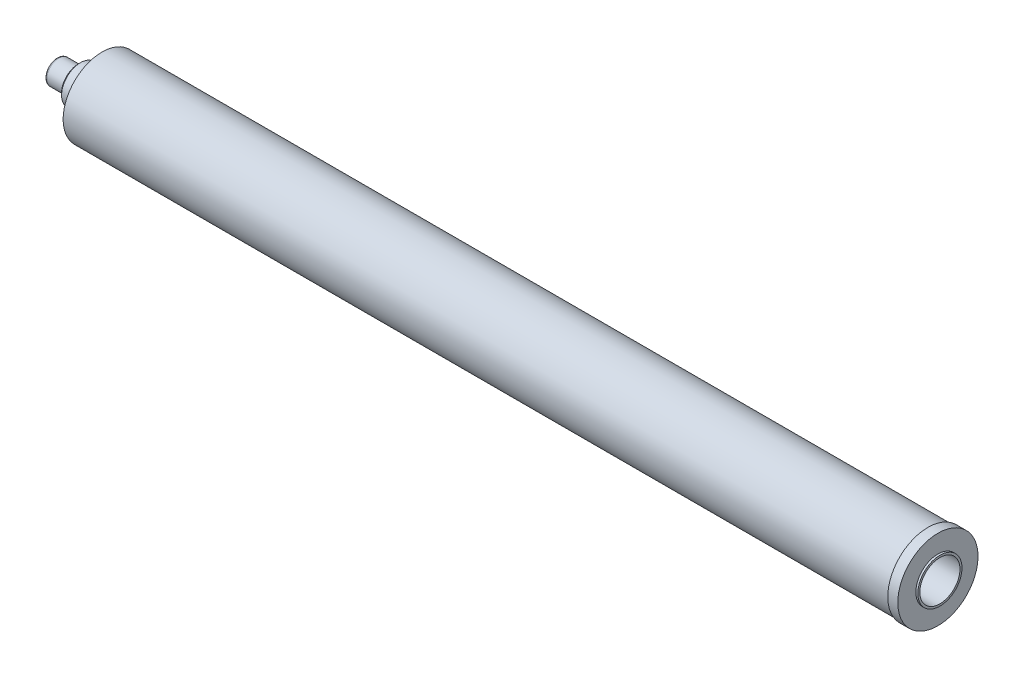
ISO-10303-21;
HEADER;
FILE_DESCRIPTION(('STEP AP214'),'2;1');
FILE_NAME('part.step','',(''),(''),'','','');
FILE_SCHEMA(('AUTOMOTIVE_DESIGN { 1 0 10303 214 1 1 1 1 }'));
ENDSEC;
DATA;
#1=APPLICATION_CONTEXT('core data for automotive mechanical design processes');
#2=APPLICATION_PROTOCOL_DEFINITION('international standard','automotive_design',2000,#1);
#3=PRODUCT_CONTEXT('',#1,'mechanical');
#4=PRODUCT('Part','Part','',(#3));
#5=PRODUCT_RELATED_PRODUCT_CATEGORY('part','',(#4));
#6=PRODUCT_DEFINITION_FORMATION('','',#4);
#7=PRODUCT_DEFINITION_CONTEXT('part definition',#1,'design');
#8=PRODUCT_DEFINITION('design','',#6,#7);
#9=PRODUCT_DEFINITION_SHAPE('','',#8);
#10=(LENGTH_UNIT() NAMED_UNIT(*) SI_UNIT(.MILLI.,.METRE.));
#11=(NAMED_UNIT(*) PLANE_ANGLE_UNIT() SI_UNIT($,.RADIAN.));
#12=(NAMED_UNIT(*) SI_UNIT($,.STERADIAN.) SOLID_ANGLE_UNIT());
#13=UNCERTAINTY_MEASURE_WITH_UNIT(LENGTH_MEASURE(1.E-05),#10,'distance_accuracy_value','');
#14=(GEOMETRIC_REPRESENTATION_CONTEXT(3) GLOBAL_UNCERTAINTY_ASSIGNED_CONTEXT((#13)) GLOBAL_UNIT_ASSIGNED_CONTEXT((#10,
#11,#12)) REPRESENTATION_CONTEXT('',''));
#15=CARTESIAN_POINT('',(0.,0.,0.));
#16=DIRECTION('',(0.,0.,1.));
#17=DIRECTION('',(1.,0.,0.));
#18=AXIS2_PLACEMENT_3D('',#15,#16,#17);
#19=CARTESIAN_POINT('',(0.,0.,0.));
#20=DIRECTION('',(-1.,0.,0.));
#21=DIRECTION('',(0.,-1.,0.));
#22=AXIS2_PLACEMENT_3D('',#19,#20,#21);
#23=PLANE('',#22);
#24=CARTESIAN_POINT('',(0.,0.,0.));
#25=DIRECTION('',(-1.,0.,0.));
#26=DIRECTION('',(0.,-1.,0.));
#27=AXIS2_PLACEMENT_3D('',#24,#25,#26);
#28=CIRCLE('',#27,12.6999999999999);
#29=CARTESIAN_POINT('',(0.,-12.6999999999999,0.));
#30=VERTEX_POINT('',#29);
#31=EDGE_CURVE('E100',#30,#30,#28,.T.);
#32=ORIENTED_EDGE('',*,*,#31,.T.);
#33=EDGE_LOOP('',(#32));
#34=FACE_BOUND('',#33,.T.);
#35=CARTESIAN_POINT('',(0.,0.,0.));
#36=DIRECTION('',(-1.,0.,0.));
#37=DIRECTION('',(0.,0.,1.));
#38=AXIS2_PLACEMENT_3D('',#35,#36,#37);
#39=CIRCLE('',#38,9.6774);
#40=CARTESIAN_POINT('',(0.,0.,9.6774));
#41=VERTEX_POINT('',#40);
#42=EDGE_CURVE('E73',#41,#41,#39,.T.);
#43=ORIENTED_EDGE('',*,*,#42,.F.);
#44=EDGE_LOOP('',(#43));
#45=FACE_BOUND('',#44,.T.);
#46=ADVANCED_FACE('F41',(#34,#45),#23,.T.);
#47=CARTESIAN_POINT('',(1115.822,1.32231727996655E-13,0.));
#48=DIRECTION('',(1.,0.,0.));
#49=DIRECTION('',(0.,1.,0.));
#50=AXIS2_PLACEMENT_3D('',#47,#48,#49);
#51=CYLINDRICAL_SURFACE('',#50,15.2399999999999);
#52=CARTESIAN_POINT('',(2.53999999999999,0.,0.));
#53=DIRECTION('',(-1.,0.,0.));
#54=DIRECTION('',(0.,-1.,0.));
#55=AXIS2_PLACEMENT_3D('',#52,#53,#54);
#56=CIRCLE('',#55,15.2399999999999);
#57=CARTESIAN_POINT('',(2.53999999999999,-15.2399999999999,0.));
#58=VERTEX_POINT('',#57);
#59=EDGE_CURVE('E96',#58,#58,#56,.F.);
#60=ORIENTED_EDGE('',*,*,#59,.T.);
#61=EDGE_LOOP('',(#60));
#62=FACE_BOUND('',#61,.T.);
#63=CARTESIAN_POINT('',(27.3049999999999,0.,0.));
#64=DIRECTION('',(1.,0.,0.));
#65=DIRECTION('',(0.,1.,0.));
#66=AXIS2_PLACEMENT_3D('',#63,#64,#65);
#67=CIRCLE('',#66,15.2399999999999);
#68=CARTESIAN_POINT('',(27.3049999999999,15.2399999999999,0.));
#69=VERTEX_POINT('',#68);
#70=EDGE_CURVE('E92',#69,#69,#67,.T.);
#71=ORIENTED_EDGE('',*,*,#70,.F.);
#72=EDGE_LOOP('',(#71));
#73=FACE_BOUND('',#72,.T.);
#74=ADVANCED_FACE('F125',(#62,#73),#51,.T.);
#75=CARTESIAN_POINT('',(27.305,15.2399999999999,0.));
#76=DIRECTION('',(-1.,0.,0.));
#77=DIRECTION('',(0.,-1.,0.));
#78=AXIS2_PLACEMENT_3D('',#75,#76,#77);
#79=PLANE('',#78);
#80=CARTESIAN_POINT('',(27.305,0.,0.));
#81=DIRECTION('',(-1.,0.,0.));
#82=DIRECTION('',(0.,-1.,0.));
#83=AXIS2_PLACEMENT_3D('',#80,#81,#82);
#84=CIRCLE('',#83,21.3359999999999);
#85=CARTESIAN_POINT('',(27.305,-21.3359999999999,0.));
#86=VERTEX_POINT('',#85);
#87=EDGE_CURVE('E11',#86,#86,#84,.T.);
#88=ORIENTED_EDGE('',*,*,#87,.T.);
#89=EDGE_LOOP('',(#88));
#90=FACE_BOUND('',#89,.T.);
#91=ORIENTED_EDGE('',*,*,#70,.T.);
#92=EDGE_LOOP('',(#91));
#93=FACE_BOUND('',#92,.T.);
#94=ADVANCED_FACE('F131',(#90,#93),#79,.T.);
#95=CARTESIAN_POINT('',(1115.822,1.32231727996655E-13,0.));
#96=DIRECTION('',(1.,0.,0.));
#97=DIRECTION('',(0.,1.,0.));
#98=AXIS2_PLACEMENT_3D('',#95,#96,#97);
#99=CYLINDRICAL_SURFACE('',#98,23.8759999999999);
#100=CARTESIAN_POINT('',(29.8450000000003,0.,0.));
#101=DIRECTION('',(-1.,0.,0.));
#102=DIRECTION('',(0.,-1.,0.));
#103=AXIS2_PLACEMENT_3D('',#100,#101,#102);
#104=CIRCLE('',#103,23.8759999999999);
#105=CARTESIAN_POINT('',(29.8450000000003,-23.8759999999999,0.));
#106=VERTEX_POINT('',#105);
#107=EDGE_CURVE('E50',#106,#106,#104,.F.);
#108=ORIENTED_EDGE('',*,*,#107,.T.);
#109=EDGE_LOOP('',(#108));
#110=FACE_BOUND('',#109,.T.);
#111=CARTESIAN_POINT('',(57.15,0.,0.));
#112=DIRECTION('',(1.,0.,0.));
#113=DIRECTION('',(0.,1.,0.));
#114=AXIS2_PLACEMENT_3D('',#111,#112,#113);
#115=CIRCLE('',#114,23.8759999999999);
#116=CARTESIAN_POINT('',(57.15,23.8759999999999,0.));
#117=VERTEX_POINT('',#116);
#118=EDGE_CURVE('E88',#117,#117,#115,.T.);
#119=ORIENTED_EDGE('',*,*,#118,.F.);
#120=EDGE_LOOP('',(#119));
#121=FACE_BOUND('',#120,.T.);
#122=ADVANCED_FACE('F107',(#110,#121),#99,.T.);
#123=CARTESIAN_POINT('',(57.15,23.8759999999999,0.));
#124=DIRECTION('',(-1.,0.,0.));
#125=DIRECTION('',(0.,-1.,0.));
#126=AXIS2_PLACEMENT_3D('',#123,#124,#125);
#127=PLANE('',#126);
#128=ORIENTED_EDGE('',*,*,#118,.T.);
#129=EDGE_LOOP('',(#128));
#130=FACE_BOUND('',#129,.T.);
#131=CARTESIAN_POINT('',(57.15,0.,0.));
#132=DIRECTION('',(1.,0.,0.));
#133=DIRECTION('',(0.,1.,0.));
#134=AXIS2_PLACEMENT_3D('',#131,#132,#133);
#135=CIRCLE('',#134,49.2124999999999);
#136=CARTESIAN_POINT('',(57.15,49.2124999999999,0.));
#137=VERTEX_POINT('',#136);
#138=EDGE_CURVE('E84',#137,#137,#135,.T.);
#139=ORIENTED_EDGE('',*,*,#138,.F.);
#140=EDGE_LOOP('',(#139));
#141=FACE_BOUND('',#140,.T.);
#142=ADVANCED_FACE('F141',(#130,#141),#127,.T.);
#143=CARTESIAN_POINT('',(1115.822,1.32231727996655E-13,0.));
#144=DIRECTION('',(1.,0.,0.));
#145=DIRECTION('',(0.,1.,0.));
#146=AXIS2_PLACEMENT_3D('',#143,#144,#145);
#147=CYLINDRICAL_SURFACE('',#146,49.2125);
#148=ORIENTED_EDGE('',*,*,#138,.T.);
#149=EDGE_LOOP('',(#148));
#150=FACE_BOUND('',#149,.T.);
#151=CARTESIAN_POINT('',(1103.122,1.3072670036182E-13,0.));
#152=DIRECTION('',(1.,0.,0.));
#153=DIRECTION('',(0.,1.,0.));
#154=AXIS2_PLACEMENT_3D('',#151,#152,#153);
#155=CIRCLE('',#154,49.2125);
#156=CARTESIAN_POINT('',(1103.122,49.2125000000001,0.));
#157=VERTEX_POINT('',#156);
#158=EDGE_CURVE('E80',#157,#157,#155,.T.);
#159=ORIENTED_EDGE('',*,*,#158,.F.);
#160=EDGE_LOOP('',(#159));
#161=FACE_BOUND('',#160,.T.);
#162=ADVANCED_FACE('F144',(#150,#161),#147,.T.);
#163=CARTESIAN_POINT('',(1103.122,49.2125000000001,0.));
#164=DIRECTION('',(-1.,0.,0.));
#165=DIRECTION('',(0.,-1.,0.));
#166=AXIS2_PLACEMENT_3D('',#163,#164,#165);
#167=PLANE('',#166);
#168=ORIENTED_EDGE('',*,*,#158,.T.);
#169=EDGE_LOOP('',(#168));
#170=FACE_BOUND('',#169,.T.);
#171=CARTESIAN_POINT('',(1103.122,1.3072670036182E-13,0.));
#172=DIRECTION('',(1.,0.,0.));
#173=DIRECTION('',(0.,1.,0.));
#174=AXIS2_PLACEMENT_3D('',#171,#172,#173);
#175=CIRCLE('',#174,50.8);
#176=CARTESIAN_POINT('',(1103.122,50.8000000000001,0.));
#177=VERTEX_POINT('',#176);
#178=EDGE_CURVE('E70',#177,#177,#175,.T.);
#179=ORIENTED_EDGE('',*,*,#178,.F.);
#180=EDGE_LOOP('',(#179));
#181=FACE_BOUND('',#180,.T.);
#182=ADVANCED_FACE('F148',(#170,#181),#167,.T.);
#183=CARTESIAN_POINT('',(1115.822,1.32231727996655E-13,0.));
#184=DIRECTION('',(1.,0.,0.));
#185=DIRECTION('',(0.,1.,0.));
#186=AXIS2_PLACEMENT_3D('',#183,#184,#185);
#187=CYLINDRICAL_SURFACE('',#186,50.8);
#188=ORIENTED_EDGE('',*,*,#178,.T.);
#189=EDGE_LOOP('',(#188));
#190=FACE_BOUND('',#189,.T.);
#191=CARTESIAN_POINT('',(1115.822,1.32231727996655E-13,0.));
#192=DIRECTION('',(1.,0.,0.));
#193=DIRECTION('',(0.,1.,0.));
#194=AXIS2_PLACEMENT_3D('',#191,#192,#193);
#195=CIRCLE('',#194,50.8);
#196=CARTESIAN_POINT('',(1115.822,50.8000000000001,0.));
#197=VERTEX_POINT('',#196);
#198=EDGE_CURVE('E64',#197,#197,#195,.T.);
#199=ORIENTED_EDGE('',*,*,#198,.F.);
#200=EDGE_LOOP('',(#199));
#201=FACE_BOUND('',#200,.T.);
#202=ADVANCED_FACE('F152',(#190,#201),#187,.T.);
#203=CARTESIAN_POINT('',(1115.822,50.8000000000001,0.));
#204=DIRECTION('',(1.,0.,0.));
#205=DIRECTION('',(0.,1.,0.));
#206=AXIS2_PLACEMENT_3D('',#203,#204,#205);
#207=PLANE('',#206);
#208=CARTESIAN_POINT('',(1115.822,1.32231727996655E-13,0.));
#209=DIRECTION('',(1.,0.,0.));
#210=DIRECTION('',(0.,1.,0.));
#211=AXIS2_PLACEMENT_3D('',#208,#209,#210);
#212=CIRCLE('',#211,27.94);
#213=CARTESIAN_POINT('',(1115.822,27.9400000000001,0.));
#214=VERTEX_POINT('',#213);
#215=EDGE_CURVE('E186',#214,#214,#212,.T.);
#216=ORIENTED_EDGE('',*,*,#215,.F.);
#217=EDGE_LOOP('',(#216));
#218=FACE_BOUND('',#217,.T.);
#219=ORIENTED_EDGE('',*,*,#198,.T.);
#220=EDGE_LOOP('',(#219));
#221=FACE_BOUND('',#220,.T.);
#222=ADVANCED_FACE('F57',(#218,#221),#207,.T.);
#223=CARTESIAN_POINT('',(25.4,0.,0.));
#224=DIRECTION('',(-1.,0.,0.));
#225=DIRECTION('',(0.,0.,1.));
#226=AXIS2_PLACEMENT_3D('',#223,#224,#225);
#227=CONICAL_SURFACE('',#226,5.04189999999999,1.02974425867665);
#228=CARTESIAN_POINT('',(28.4294791550751,0.,0.));
#229=VERTEX_POINT('',#228);
#230=VERTEX_LOOP('',#229);
#231=FACE_BOUND('',#230,.T.);
#232=CARTESIAN_POINT('',(25.4,0.,0.));
#233=DIRECTION('',(-1.,0.,0.));
#234=DIRECTION('',(0.,0.,1.));
#235=AXIS2_PLACEMENT_3D('',#232,#233,#234);
#236=CIRCLE('',#235,5.04189999999999);
#237=CARTESIAN_POINT('',(25.4,0.,5.04189999999999));
#238=VERTEX_POINT('',#237);
#239=EDGE_CURVE('E61',#238,#238,#236,.T.);
#240=ORIENTED_EDGE('',*,*,#239,.T.);
#241=EDGE_LOOP('',(#240));
#242=FACE_BOUND('',#241,.T.);
#243=ADVANCED_FACE('F53',(#231,#242),#227,.F.);
#244=CARTESIAN_POINT('',(0.,0.,0.));
#245=DIRECTION('',(-1.,0.,0.));
#246=DIRECTION('',(0.,0.,1.));
#247=AXIS2_PLACEMENT_3D('',#244,#245,#246);
#248=CYLINDRICAL_SURFACE('',#247,5.04189999999999);
#249=ORIENTED_EDGE('',*,*,#239,.F.);
#250=EDGE_LOOP('',(#249));
#251=FACE_BOUND('',#250,.T.);
#252=CARTESIAN_POINT('',(3.88964634032228,0.,0.));
#253=DIRECTION('',(-1.,0.,0.));
#254=DIRECTION('',(0.,0.,1.));
#255=AXIS2_PLACEMENT_3D('',#252,#253,#254);
#256=CIRCLE('',#255,5.04189999999999);
#257=CARTESIAN_POINT('',(3.88964634032228,0.,5.04189999999999));
#258=VERTEX_POINT('',#257);
#259=EDGE_CURVE('E65',#258,#258,#256,.T.);
#260=ORIENTED_EDGE('',*,*,#259,.T.);
#261=EDGE_LOOP('',(#260));
#262=FACE_BOUND('',#261,.T.);
#263=ADVANCED_FACE('F56',(#251,#262),#248,.F.);
#264=CARTESIAN_POINT('',(0.,0.,0.));
#265=DIRECTION('',(-1.,0.,0.));
#266=DIRECTION('',(0.,0.,1.));
#267=AXIS2_PLACEMENT_3D('',#264,#265,#266);
#268=CONICAL_SURFACE('',#267,9.6774,0.872664625997166);
#269=ORIENTED_EDGE('',*,*,#259,.F.);
#270=EDGE_LOOP('',(#269));
#271=FACE_BOUND('',#270,.T.);
#272=ORIENTED_EDGE('',*,*,#42,.T.);
#273=EDGE_LOOP('',(#272));
#274=FACE_BOUND('',#273,.T.);
#275=ADVANCED_FACE('F121',(#271,#274),#268,.F.);
#276=CARTESIAN_POINT('',(2.53999999999999,0.,0.));
#277=DIRECTION('',(-1.,0.,0.));
#278=DIRECTION('',(0.,-1.,0.));
#279=AXIS2_PLACEMENT_3D('',#276,#277,#278);
#280=TOROIDAL_SURFACE('',#279,12.6999999999999,2.54);
#281=ORIENTED_EDGE('',*,*,#31,.F.);
#282=EDGE_LOOP('',(#281));
#283=FACE_BOUND('',#282,.T.);
#284=ORIENTED_EDGE('',*,*,#59,.F.);
#285=EDGE_LOOP('',(#284));
#286=FACE_BOUND('',#285,.T.);
#287=ADVANCED_FACE('F112',(#283,#286),#280,.T.);
#288=CARTESIAN_POINT('',(29.8450000000003,0.,0.));
#289=DIRECTION('',(1.,0.,0.));
#290=DIRECTION('',(0.,1.,0.));
#291=AXIS2_PLACEMENT_3D('',#288,#289,#290);
#292=CONICAL_SURFACE('',#291,23.8759999999999,0.785398163397392);
#293=ORIENTED_EDGE('',*,*,#87,.F.);
#294=EDGE_LOOP('',(#293));
#295=FACE_BOUND('',#294,.T.);
#296=ORIENTED_EDGE('',*,*,#107,.F.);
#297=EDGE_LOOP('',(#296));
#298=FACE_BOUND('',#297,.T.);
#299=ADVANCED_FACE('F44',(#295,#298),#292,.T.);
#300=CARTESIAN_POINT('',(1118.362,1.32367952547961E-13,0.));
#301=DIRECTION('',(1.,0.,0.));
#302=DIRECTION('',(0.,1.,0.));
#303=AXIS2_PLACEMENT_3D('',#300,#301,#302);
#304=PLANE('',#303);
#305=CARTESIAN_POINT('',(1118.362,1.32367952547961E-13,0.));
#306=DIRECTION('',(1.,0.,0.));
#307=DIRECTION('',(0.,1.,0.));
#308=AXIS2_PLACEMENT_3D('',#305,#306,#307);
#309=CIRCLE('',#308,27.94);
#310=CARTESIAN_POINT('',(1118.362,27.9400000000001,0.));
#311=VERTEX_POINT('',#310);
#312=EDGE_CURVE('E189',#311,#311,#309,.T.);
#313=ORIENTED_EDGE('',*,*,#312,.T.);
#314=EDGE_LOOP('',(#313));
#315=FACE_BOUND('',#314,.T.);
#316=CARTESIAN_POINT('',(1118.362,1.32367952547961E-13,0.));
#317=DIRECTION('',(1.,0.,0.));
#318=DIRECTION('',(0.,1.,0.));
#319=AXIS2_PLACEMENT_3D('',#316,#317,#318);
#320=CIRCLE('',#319,25.4);
#321=CARTESIAN_POINT('',(1118.362,25.4000000000001,0.));
#322=VERTEX_POINT('',#321);
#323=EDGE_CURVE('E182',#322,#322,#320,.T.);
#324=ORIENTED_EDGE('',*,*,#323,.F.);
#325=EDGE_LOOP('',(#324));
#326=FACE_BOUND('',#325,.T.);
#327=ADVANCED_FACE('F111',(#315,#326),#304,.T.);
#328=CARTESIAN_POINT('',(1118.362,1.32367952547961E-13,0.));
#329=DIRECTION('',(-1.,0.,0.));
#330=DIRECTION('',(0.,-1.,0.));
#331=AXIS2_PLACEMENT_3D('',#328,#329,#330);
#332=CYLINDRICAL_SURFACE('',#331,27.94);
#333=ORIENTED_EDGE('',*,*,#312,.F.);
#334=EDGE_LOOP('',(#333));
#335=FACE_BOUND('',#334,.T.);
#336=ORIENTED_EDGE('',*,*,#215,.T.);
#337=EDGE_LOOP('',(#336));
#338=FACE_BOUND('',#337,.T.);
#339=ADVANCED_FACE('F118',(#335,#338),#332,.T.);
#340=CARTESIAN_POINT('',(1118.362,1.32367952547961E-13,0.));
#341=DIRECTION('',(-1.,0.,0.));
#342=DIRECTION('',(0.,-1.,0.));
#343=AXIS2_PLACEMENT_3D('',#340,#341,#342);
#344=CYLINDRICAL_SURFACE('',#343,25.4);
#345=ORIENTED_EDGE('',*,*,#323,.T.);
#346=EDGE_LOOP('',(#345));
#347=FACE_BOUND('',#346,.T.);
#348=CARTESIAN_POINT('',(610.362,1.05123042286807E-13,0.));
#349=DIRECTION('',(1.,0.,0.));
#350=DIRECTION('',(0.,1.,0.));
#351=AXIS2_PLACEMENT_3D('',#348,#349,#350);
#352=CIRCLE('',#351,25.4);
#353=CARTESIAN_POINT('',(610.362,25.4000000000001,0.));
#354=VERTEX_POINT('',#353);
#355=EDGE_CURVE('E179',#354,#354,#352,.T.);
#356=ORIENTED_EDGE('',*,*,#355,.F.);
#357=EDGE_LOOP('',(#356));
#358=FACE_BOUND('',#357,.T.);
#359=ADVANCED_FACE('F166',(#347,#358),#344,.F.);
#360=CARTESIAN_POINT('',(610.362,1.05123042286807E-13,0.));
#361=DIRECTION('',(1.,0.,0.));
#362=DIRECTION('',(0.,1.,0.));
#363=AXIS2_PLACEMENT_3D('',#360,#361,#362);
#364=PLANE('',#363);
#365=ORIENTED_EDGE('',*,*,#355,.T.);
#366=EDGE_LOOP('',(#365));
#367=FACE_BOUND('',#366,.T.);
#368=ADVANCED_FACE('F171',(#367),#364,.T.);
#369=CLOSED_SHELL('',(#46,#74,#94,#122,#142,#162,#182,#202,#222,#243,#263,#275,#287,#299,#327,
#339,#359,#368));
#370=MANIFOLD_SOLID_BREP('B2',#369);
#371=ADVANCED_BREP_SHAPE_REPRESENTATION('',(#18,#370),#14);
#372=SHAPE_DEFINITION_REPRESENTATION(#9,#371);
ENDSEC;
END-ISO-10303-21;
